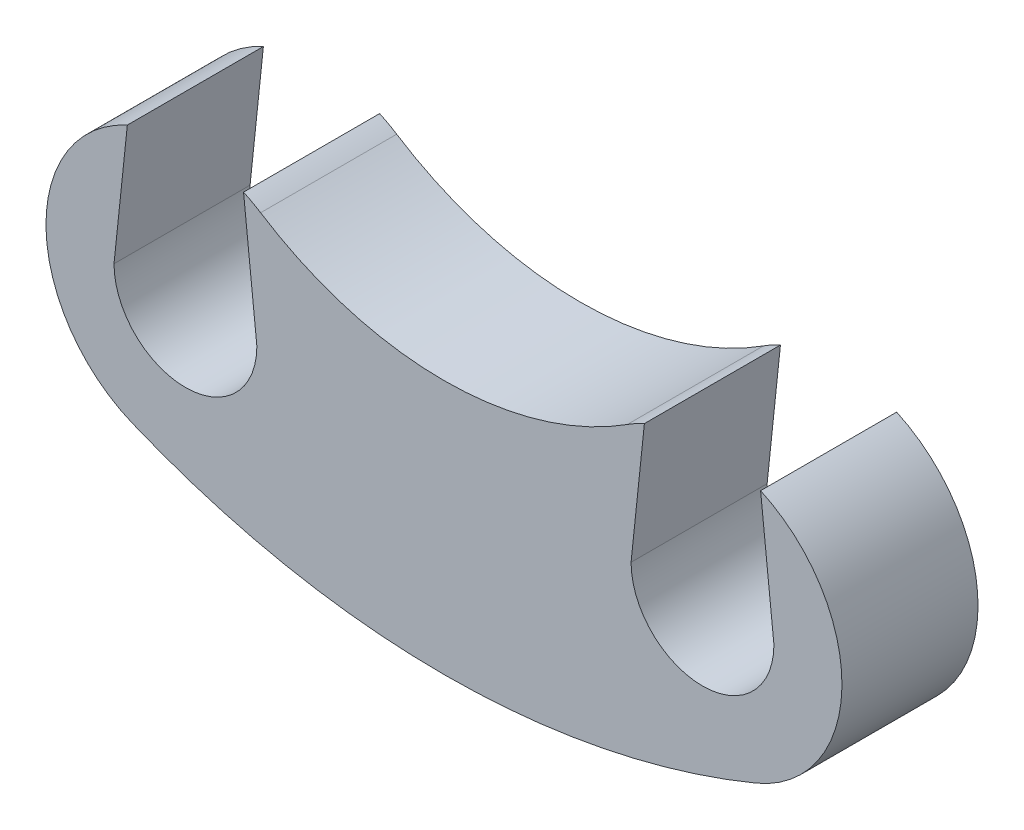
ISO-10303-21;
HEADER;
FILE_DESCRIPTION(('STEP AP214'),'2;1');
FILE_NAME('part.step','',(''),(''),'','','');
FILE_SCHEMA(('AUTOMOTIVE_DESIGN { 1 0 10303 214 1 1 1 1 }'));
ENDSEC;
DATA;
#1=APPLICATION_CONTEXT('core data for automotive mechanical design processes');
#2=APPLICATION_PROTOCOL_DEFINITION('international standard','automotive_design',2000,#1);
#3=PRODUCT_CONTEXT('',#1,'mechanical');
#4=PRODUCT('Part','Part','',(#3));
#5=PRODUCT_RELATED_PRODUCT_CATEGORY('part','',(#4));
#6=PRODUCT_DEFINITION_FORMATION('','',#4);
#7=PRODUCT_DEFINITION_CONTEXT('part definition',#1,'design');
#8=PRODUCT_DEFINITION('design','',#6,#7);
#9=PRODUCT_DEFINITION_SHAPE('','',#8);
#10=(LENGTH_UNIT() NAMED_UNIT(*) SI_UNIT(.MILLI.,.METRE.));
#11=(NAMED_UNIT(*) PLANE_ANGLE_UNIT() SI_UNIT($,.RADIAN.));
#12=(NAMED_UNIT(*) SI_UNIT($,.STERADIAN.) SOLID_ANGLE_UNIT());
#13=UNCERTAINTY_MEASURE_WITH_UNIT(LENGTH_MEASURE(1.E-05),#10,'distance_accuracy_value','');
#14=(GEOMETRIC_REPRESENTATION_CONTEXT(3) GLOBAL_UNCERTAINTY_ASSIGNED_CONTEXT((#13)) GLOBAL_UNIT_ASSIGNED_CONTEXT((#10,
#11,#12)) REPRESENTATION_CONTEXT('',''));
#15=CARTESIAN_POINT('',(0.,0.,0.));
#16=DIRECTION('',(0.,0.,1.));
#17=DIRECTION('',(1.,0.,0.));
#18=AXIS2_PLACEMENT_3D('',#15,#16,#17);
#19=CARTESIAN_POINT('',(0.,0.,10.));
#20=DIRECTION('',(0.,0.,-1.));
#21=DIRECTION('',(-1.,0.,0.));
#22=AXIS2_PLACEMENT_3D('',#19,#20,#21);
#23=CYLINDRICAL_SURFACE('',#22,10.25);
#24=CARTESIAN_POINT('',(0.,0.,0.));
#25=DIRECTION('',(0.,0.,1.));
#26=DIRECTION('',(-1.,0.,0.));
#27=AXIS2_PLACEMENT_3D('',#24,#25,#26);
#28=CIRCLE('',#27,10.25);
#29=CARTESIAN_POINT('',(-4.27064453791528,9.31794479650821,0.));
#30=VERTEX_POINT('',#29);
#31=CARTESIAN_POINT('',(-3.91457286432163,-9.47304699080063,0.));
#32=VERTEX_POINT('',#31);
#33=EDGE_CURVE('E153',#30,#32,#28,.T.);
#34=ORIENTED_EDGE('',*,*,#33,.T.);
#35=DIRECTION('',(0.,0.,-1.));
#36=VECTOR('',#35,1.);
#37=CARTESIAN_POINT('',(-3.91457286432163,-9.47304699080063,10.));
#38=LINE('',#37,#36);
#39=CARTESIAN_POINT('',(-3.91457286432163,-9.47304699080063,10.));
#40=VERTEX_POINT('',#39);
#41=EDGE_CURVE('E11',#40,#32,#38,.T.);
#42=ORIENTED_EDGE('',*,*,#41,.F.);
#43=CARTESIAN_POINT('',(0.,0.,10.));
#44=DIRECTION('',(0.,0.,1.));
#45=DIRECTION('',(-1.,0.,0.));
#46=AXIS2_PLACEMENT_3D('',#43,#44,#45);
#47=CIRCLE('',#46,10.25);
#48=CARTESIAN_POINT('',(-4.27064453791528,9.31794479650821,10.));
#49=VERTEX_POINT('',#48);
#50=EDGE_CURVE('E175',#49,#40,#47,.T.);
#51=ORIENTED_EDGE('',*,*,#50,.F.);
#52=DIRECTION('',(0.,0.,-1.));
#53=VECTOR('',#52,1.);
#54=CARTESIAN_POINT('',(-4.27064453791528,9.31794479650821,10.));
#55=LINE('',#54,#53);
#56=EDGE_CURVE('E149',#49,#30,#55,.T.);
#57=ORIENTED_EDGE('',*,*,#56,.T.);
#58=EDGE_LOOP('',(#34,#42,#51,#57));
#59=FACE_BOUND('',#58,.T.);
#60=ADVANCED_FACE('F33',(#59),#23,.T.);
#61=CARTESIAN_POINT('',(19.,45.9789353943738,10.));
#62=DIRECTION('',(0.,0.,-1.));
#63=DIRECTION('',(-1.,0.,0.));
#64=AXIS2_PLACEMENT_3D('',#61,#62,#63);
#65=CYLINDRICAL_SURFACE('',#64,60.);
#66=CARTESIAN_POINT('',(19.,45.9789353943738,0.));
#67=DIRECTION('',(0.,0.,1.));
#68=DIRECTION('',(1.,0.,0.));
#69=AXIS2_PLACEMENT_3D('',#66,#67,#68);
#70=CIRCLE('',#69,60.);
#71=CARTESIAN_POINT('',(41.9145728643216,-9.47304699080064,0.));
#72=VERTEX_POINT('',#71);
#73=EDGE_CURVE('E156',#32,#72,#70,.T.);
#74=ORIENTED_EDGE('',*,*,#73,.T.);
#75=DIRECTION('',(0.,0.,-1.));
#76=VECTOR('',#75,1.);
#77=CARTESIAN_POINT('',(41.9145728643216,-9.47304699080064,10.));
#78=LINE('',#77,#76);
#79=CARTESIAN_POINT('',(41.9145728643216,-9.47304699080064,10.));
#80=VERTEX_POINT('',#79);
#81=EDGE_CURVE('E41',#80,#72,#78,.T.);
#82=ORIENTED_EDGE('',*,*,#81,.F.);
#83=CARTESIAN_POINT('',(19.,45.9789353943738,10.));
#84=DIRECTION('',(0.,0.,1.));
#85=DIRECTION('',(1.,0.,0.));
#86=AXIS2_PLACEMENT_3D('',#83,#84,#85);
#87=CIRCLE('',#86,60.);
#88=EDGE_CURVE('E104',#40,#80,#87,.T.);
#89=ORIENTED_EDGE('',*,*,#88,.F.);
#90=ORIENTED_EDGE('',*,*,#41,.T.);
#91=EDGE_LOOP('',(#74,#82,#89,#90));
#92=FACE_BOUND('',#91,.T.);
#93=ADVANCED_FACE('F253',(#92),#65,.T.);
#94=CARTESIAN_POINT('',(38.,0.,10.));
#95=DIRECTION('',(0.,0.,-1.));
#96=DIRECTION('',(-1.,0.,0.));
#97=AXIS2_PLACEMENT_3D('',#94,#95,#96);
#98=CYLINDRICAL_SURFACE('',#97,10.25);
#99=CARTESIAN_POINT('',(38.,0.,0.));
#100=DIRECTION('',(0.,0.,1.));
#101=DIRECTION('',(-1.,0.,0.));
#102=AXIS2_PLACEMENT_3D('',#99,#100,#101);
#103=CIRCLE('',#102,10.25);
#104=CARTESIAN_POINT('',(42.2706445379153,9.31794479650821,0.));
#105=VERTEX_POINT('',#104);
#106=EDGE_CURVE('E158',#72,#105,#103,.T.);
#107=ORIENTED_EDGE('',*,*,#106,.T.);
#108=DIRECTION('',(0.,0.,-1.));
#109=VECTOR('',#108,1.);
#110=CARTESIAN_POINT('',(42.2706445379153,9.31794479650821,10.));
#111=LINE('',#110,#109);
#112=CARTESIAN_POINT('',(42.2706445379153,9.31794479650821,10.));
#113=VERTEX_POINT('',#112);
#114=EDGE_CURVE('E194',#113,#105,#111,.T.);
#115=ORIENTED_EDGE('',*,*,#114,.F.);
#116=CARTESIAN_POINT('',(38.,0.,10.));
#117=DIRECTION('',(0.,0.,1.));
#118=DIRECTION('',(-1.,0.,0.));
#119=AXIS2_PLACEMENT_3D('',#116,#117,#118);
#120=CIRCLE('',#119,10.25);
#121=EDGE_CURVE('E202',#80,#113,#120,.T.);
#122=ORIENTED_EDGE('',*,*,#121,.F.);
#123=ORIENTED_EDGE('',*,*,#81,.T.);
#124=EDGE_LOOP('',(#107,#115,#122,#123));
#125=FACE_BOUND('',#124,.T.);
#126=ADVANCED_FACE('F200',(#125),#98,.T.);
#127=CARTESIAN_POINT('',(42.2706445379153,9.31794479650821,10.));
#128=DIRECTION('',(0.994521895368274,0.104528463267647,0.));
#129=DIRECTION('',(-0.104528463267647,0.994521895368274,0.));
#130=AXIS2_PLACEMENT_3D('',#127,#128,#129);
#131=PLANE('',#130);
#132=DIRECTION('',(0.104528463267647,-0.994521895368274,0.));
#133=VECTOR('',#132,1.);
#134=CARTESIAN_POINT('',(42.2706445379153,9.31794479650821,0.));
#135=LINE('',#134,#133);
#136=CARTESIAN_POINT('',(43.25,0.,0.));
#137=VERTEX_POINT('',#136);
#138=EDGE_CURVE('E160',#105,#137,#135,.T.);
#139=ORIENTED_EDGE('',*,*,#138,.T.);
#140=DIRECTION('',(0.,0.,-1.));
#141=VECTOR('',#140,1.);
#142=CARTESIAN_POINT('',(43.25,0.,10.));
#143=LINE('',#142,#141);
#144=CARTESIAN_POINT('',(43.25,0.,10.));
#145=VERTEX_POINT('',#144);
#146=EDGE_CURVE('E191',#145,#137,#143,.T.);
#147=ORIENTED_EDGE('',*,*,#146,.F.);
#148=DIRECTION('',(0.104528463267647,-0.994521895368274,0.));
#149=VECTOR('',#148,1.);
#150=CARTESIAN_POINT('',(42.2706445379153,9.31794479650821,10.));
#151=LINE('',#150,#149);
#152=EDGE_CURVE('E220',#113,#145,#151,.T.);
#153=ORIENTED_EDGE('',*,*,#152,.F.);
#154=ORIENTED_EDGE('',*,*,#114,.T.);
#155=EDGE_LOOP('',(#139,#147,#153,#154));
#156=FACE_BOUND('',#155,.T.);
#157=ADVANCED_FACE('F211',(#156),#131,.F.);
#158=CARTESIAN_POINT('',(38.,0.,10.));
#159=DIRECTION('',(0.,0.,-1.));
#160=DIRECTION('',(-1.,0.,0.));
#161=AXIS2_PLACEMENT_3D('',#158,#159,#160);
#162=CYLINDRICAL_SURFACE('',#161,5.25);
#163=CARTESIAN_POINT('',(38.,0.,0.));
#164=DIRECTION('',(0.,0.,-1.));
#165=DIRECTION('',(1.,0.,0.));
#166=AXIS2_PLACEMENT_3D('',#163,#164,#165);
#167=CIRCLE('',#166,5.25);
#168=CARTESIAN_POINT('',(32.75,0.,0.));
#169=VERTEX_POINT('',#168);
#170=EDGE_CURVE('E162',#137,#169,#167,.T.);
#171=ORIENTED_EDGE('',*,*,#170,.T.);
#172=DIRECTION('',(0.,0.,-1.));
#173=VECTOR('',#172,1.);
#174=CARTESIAN_POINT('',(32.75,0.,10.));
#175=LINE('',#174,#173);
#176=CARTESIAN_POINT('',(32.75,0.,10.));
#177=VERTEX_POINT('',#176);
#178=EDGE_CURVE('E188',#177,#169,#175,.T.);
#179=ORIENTED_EDGE('',*,*,#178,.F.);
#180=CARTESIAN_POINT('',(38.,0.,10.));
#181=DIRECTION('',(0.,0.,-1.));
#182=DIRECTION('',(1.,0.,0.));
#183=AXIS2_PLACEMENT_3D('',#180,#181,#182);
#184=CIRCLE('',#183,5.25);
#185=EDGE_CURVE('E217',#145,#177,#184,.T.);
#186=ORIENTED_EDGE('',*,*,#185,.F.);
#187=ORIENTED_EDGE('',*,*,#146,.T.);
#188=EDGE_LOOP('',(#171,#179,#186,#187));
#189=FACE_BOUND('',#188,.T.);
#190=ADVANCED_FACE('F215',(#189),#162,.F.);
#191=CARTESIAN_POINT('',(33.7293554620847,9.31794479650821,10.));
#192=DIRECTION('',(-0.994521895368274,0.104528463267647,0.));
#193=DIRECTION('',(-0.104528463267647,-0.994521895368274,0.));
#194=AXIS2_PLACEMENT_3D('',#191,#192,#193);
#195=PLANE('',#194);
#196=DIRECTION('',(0.104528463267647,0.994521895368274,0.));
#197=VECTOR('',#196,1.);
#198=CARTESIAN_POINT('',(33.7293554620847,9.31794479650821,0.));
#199=LINE('',#198,#197);
#200=CARTESIAN_POINT('',(33.7293554620847,9.31794479650821,0.));
#201=VERTEX_POINT('',#200);
#202=EDGE_CURVE('E164',#169,#201,#199,.T.);
#203=ORIENTED_EDGE('',*,*,#202,.T.);
#204=DIRECTION('',(0.,0.,-1.));
#205=VECTOR('',#204,1.);
#206=CARTESIAN_POINT('',(33.7293554620847,9.31794479650821,10.));
#207=LINE('',#206,#205);
#208=CARTESIAN_POINT('',(33.7293554620847,9.31794479650821,10.));
#209=VERTEX_POINT('',#208);
#210=EDGE_CURVE('E185',#209,#201,#207,.T.);
#211=ORIENTED_EDGE('',*,*,#210,.F.);
#212=DIRECTION('',(0.104528463267647,0.994521895368274,0.));
#213=VECTOR('',#212,1.);
#214=CARTESIAN_POINT('',(33.7293554620847,9.31794479650821,10.));
#215=LINE('',#214,#213);
#216=EDGE_CURVE('E219',#177,#209,#215,.T.);
#217=ORIENTED_EDGE('',*,*,#216,.F.);
#218=ORIENTED_EDGE('',*,*,#178,.T.);
#219=EDGE_LOOP('',(#203,#211,#217,#218));
#220=FACE_BOUND('',#219,.T.);
#221=ADVANCED_FACE('F266',(#220),#195,.F.);
#222=CARTESIAN_POINT('',(38.,0.,10.));
#223=DIRECTION('',(0.,0.,-1.));
#224=DIRECTION('',(-1.,0.,0.));
#225=AXIS2_PLACEMENT_3D('',#222,#223,#224);
#226=CYLINDRICAL_SURFACE('',#225,10.25);
#227=CARTESIAN_POINT('',(38.,0.,0.));
#228=DIRECTION('',(0.,0.,1.));
#229=DIRECTION('',(-1.,0.,0.));
#230=AXIS2_PLACEMENT_3D('',#227,#228,#229);
#231=CIRCLE('',#230,10.25);
#232=CARTESIAN_POINT('',(32.4751773049645,8.6335875618668,0.));
#233=VERTEX_POINT('',#232);
#234=EDGE_CURVE('E166',#201,#233,#231,.T.);
#235=ORIENTED_EDGE('',*,*,#234,.T.);
#236=DIRECTION('',(0.,0.,-1.));
#237=VECTOR('',#236,1.);
#238=CARTESIAN_POINT('',(32.4751773049645,8.6335875618668,10.));
#239=LINE('',#238,#237);
#240=CARTESIAN_POINT('',(32.4751773049645,8.6335875618668,10.));
#241=VERTEX_POINT('',#240);
#242=EDGE_CURVE('E182',#241,#233,#239,.T.);
#243=ORIENTED_EDGE('',*,*,#242,.F.);
#244=CARTESIAN_POINT('',(38.,0.,10.));
#245=DIRECTION('',(0.,0.,1.));
#246=DIRECTION('',(-1.,0.,0.));
#247=AXIS2_PLACEMENT_3D('',#244,#245,#246);
#248=CIRCLE('',#247,10.25);
#249=EDGE_CURVE('E222',#209,#241,#248,.T.);
#250=ORIENTED_EDGE('',*,*,#249,.F.);
#251=ORIENTED_EDGE('',*,*,#210,.T.);
#252=EDGE_LOOP('',(#235,#243,#250,#251));
#253=FACE_BOUND('',#252,.T.);
#254=ADVANCED_FACE('F269',(#253),#226,.T.);
#255=CARTESIAN_POINT('',(19.,29.6911182005663,10.));
#256=DIRECTION('',(0.,0.,-1.));
#257=DIRECTION('',(-1.,0.,0.));
#258=AXIS2_PLACEMENT_3D('',#255,#256,#257);
#259=CYLINDRICAL_SURFACE('',#258,25.);
#260=CARTESIAN_POINT('',(19.,29.6911182005663,0.));
#261=DIRECTION('',(0.,0.,-1.));
#262=DIRECTION('',(1.,0.,0.));
#263=AXIS2_PLACEMENT_3D('',#260,#261,#262);
#264=CIRCLE('',#263,25.);
#265=CARTESIAN_POINT('',(5.52482269503545,8.63358756186681,0.));
#266=VERTEX_POINT('',#265);
#267=EDGE_CURVE('E168',#233,#266,#264,.T.);
#268=ORIENTED_EDGE('',*,*,#267,.T.);
#269=DIRECTION('',(0.,0.,-1.));
#270=VECTOR('',#269,1.);
#271=CARTESIAN_POINT('',(5.52482269503545,8.63358756186681,10.));
#272=LINE('',#271,#270);
#273=CARTESIAN_POINT('',(5.52482269503545,8.63358756186681,10.));
#274=VERTEX_POINT('',#273);
#275=EDGE_CURVE('E179',#274,#266,#272,.T.);
#276=ORIENTED_EDGE('',*,*,#275,.F.);
#277=CARTESIAN_POINT('',(19.,29.6911182005663,10.));
#278=DIRECTION('',(0.,0.,-1.));
#279=DIRECTION('',(1.,0.,0.));
#280=AXIS2_PLACEMENT_3D('',#277,#278,#279);
#281=CIRCLE('',#280,25.);
#282=EDGE_CURVE('E228',#241,#274,#281,.T.);
#283=ORIENTED_EDGE('',*,*,#282,.F.);
#284=ORIENTED_EDGE('',*,*,#242,.T.);
#285=EDGE_LOOP('',(#268,#276,#283,#284));
#286=FACE_BOUND('',#285,.T.);
#287=ADVANCED_FACE('F234',(#286),#259,.F.);
#288=CARTESIAN_POINT('',(-2.87096735274162E-13,-6.15826833971767E-13,10.));
#289=DIRECTION('',(0.,0.,-1.));
#290=DIRECTION('',(-1.,0.,0.));
#291=AXIS2_PLACEMENT_3D('',#288,#289,#290);
#292=CYLINDRICAL_SURFACE('',#291,10.2500000000007);
#293=CARTESIAN_POINT('',(-2.87096735274162E-13,-6.15826833971767E-13,0.));
#294=DIRECTION('',(0.,0.,1.));
#295=DIRECTION('',(1.,0.,0.));
#296=AXIS2_PLACEMENT_3D('',#293,#294,#295);
#297=CIRCLE('',#296,10.2500000000007);
#298=CARTESIAN_POINT('',(4.27064453791528,9.31794479650821,0.));
#299=VERTEX_POINT('',#298);
#300=EDGE_CURVE('E170',#266,#299,#297,.T.);
#301=ORIENTED_EDGE('',*,*,#300,.T.);
#302=DIRECTION('',(0.,0.,-1.));
#303=VECTOR('',#302,1.);
#304=CARTESIAN_POINT('',(4.27064453791528,9.31794479650821,10.));
#305=LINE('',#304,#303);
#306=CARTESIAN_POINT('',(4.27064453791528,9.31794479650821,10.));
#307=VERTEX_POINT('',#306);
#308=EDGE_CURVE('E144',#307,#299,#305,.T.);
#309=ORIENTED_EDGE('',*,*,#308,.F.);
#310=CARTESIAN_POINT('',(-2.87096735274162E-13,-6.15826833971767E-13,10.));
#311=DIRECTION('',(0.,0.,1.));
#312=DIRECTION('',(1.,0.,0.));
#313=AXIS2_PLACEMENT_3D('',#310,#311,#312);
#314=CIRCLE('',#313,10.2500000000007);
#315=EDGE_CURVE('E135',#274,#307,#314,.T.);
#316=ORIENTED_EDGE('',*,*,#315,.F.);
#317=ORIENTED_EDGE('',*,*,#275,.T.);
#318=EDGE_LOOP('',(#301,#309,#316,#317));
#319=FACE_BOUND('',#318,.T.);
#320=ADVANCED_FACE('F238',(#319),#292,.T.);
#321=CARTESIAN_POINT('',(4.27064453791528,9.31794479650821,10.));
#322=DIRECTION('',(0.994521895368274,0.104528463267647,0.));
#323=DIRECTION('',(-0.104528463267647,0.994521895368274,0.));
#324=AXIS2_PLACEMENT_3D('',#321,#322,#323);
#325=PLANE('',#324);
#326=DIRECTION('',(0.104528463267647,-0.994521895368274,0.));
#327=VECTOR('',#326,1.);
#328=CARTESIAN_POINT('',(4.27064453791528,9.31794479650821,0.));
#329=LINE('',#328,#327);
#330=CARTESIAN_POINT('',(5.25,0.,0.));
#331=VERTEX_POINT('',#330);
#332=EDGE_CURVE('E143',#299,#331,#329,.T.);
#333=ORIENTED_EDGE('',*,*,#332,.T.);
#334=DIRECTION('',(0.,0.,-1.));
#335=VECTOR('',#334,1.);
#336=CARTESIAN_POINT('',(5.25,0.,10.));
#337=LINE('',#336,#335);
#338=CARTESIAN_POINT('',(5.25,0.,10.));
#339=VERTEX_POINT('',#338);
#340=EDGE_CURVE('E140',#339,#331,#337,.T.);
#341=ORIENTED_EDGE('',*,*,#340,.F.);
#342=DIRECTION('',(0.104528463267647,-0.994521895368274,0.));
#343=VECTOR('',#342,1.);
#344=CARTESIAN_POINT('',(4.27064453791528,9.31794479650821,10.));
#345=LINE('',#344,#343);
#346=EDGE_CURVE('E129',#307,#339,#345,.T.);
#347=ORIENTED_EDGE('',*,*,#346,.F.);
#348=ORIENTED_EDGE('',*,*,#308,.T.);
#349=EDGE_LOOP('',(#333,#341,#347,#348));
#350=FACE_BOUND('',#349,.T.);
#351=ADVANCED_FACE('F141',(#350),#325,.F.);
#352=CARTESIAN_POINT('',(0.,0.,10.));
#353=DIRECTION('',(0.,0.,-1.));
#354=DIRECTION('',(-1.,0.,0.));
#355=AXIS2_PLACEMENT_3D('',#352,#353,#354);
#356=CYLINDRICAL_SURFACE('',#355,5.25);
#357=CARTESIAN_POINT('',(0.,0.,0.));
#358=DIRECTION('',(0.,0.,-1.));
#359=DIRECTION('',(1.,0.,0.));
#360=AXIS2_PLACEMENT_3D('',#357,#358,#359);
#361=CIRCLE('',#360,5.25);
#362=CARTESIAN_POINT('',(-5.25,0.,0.));
#363=VERTEX_POINT('',#362);
#364=EDGE_CURVE('E90',#331,#363,#361,.T.);
#365=ORIENTED_EDGE('',*,*,#364,.T.);
#366=DIRECTION('',(0.,0.,-1.));
#367=VECTOR('',#366,1.);
#368=CARTESIAN_POINT('',(-5.25,0.,10.));
#369=LINE('',#368,#367);
#370=CARTESIAN_POINT('',(-5.25,0.,10.));
#371=VERTEX_POINT('',#370);
#372=EDGE_CURVE('E145',#371,#363,#369,.T.);
#373=ORIENTED_EDGE('',*,*,#372,.F.);
#374=CARTESIAN_POINT('',(0.,0.,10.));
#375=DIRECTION('',(0.,0.,-1.));
#376=DIRECTION('',(1.,0.,0.));
#377=AXIS2_PLACEMENT_3D('',#374,#375,#376);
#378=CIRCLE('',#377,5.25);
#379=EDGE_CURVE('E133',#339,#371,#378,.T.);
#380=ORIENTED_EDGE('',*,*,#379,.F.);
#381=ORIENTED_EDGE('',*,*,#340,.T.);
#382=EDGE_LOOP('',(#365,#373,#380,#381));
#383=FACE_BOUND('',#382,.T.);
#384=ADVANCED_FACE('F147',(#383),#356,.F.);
#385=CARTESIAN_POINT('',(-5.25,0.,10.));
#386=DIRECTION('',(-0.994521895368274,0.104528463267646,0.));
#387=DIRECTION('',(-0.104528463267646,-0.994521895368274,0.));
#388=AXIS2_PLACEMENT_3D('',#385,#386,#387);
#389=PLANE('',#388);
#390=DIRECTION('',(0.104528463267646,0.994521895368274,0.));
#391=VECTOR('',#390,1.);
#392=CARTESIAN_POINT('',(-5.25,0.,0.));
#393=LINE('',#392,#391);
#394=EDGE_CURVE('E96',#363,#30,#393,.T.);
#395=ORIENTED_EDGE('',*,*,#394,.T.);
#396=ORIENTED_EDGE('',*,*,#56,.F.);
#397=DIRECTION('',(0.104528463267646,0.994521895368274,0.));
#398=VECTOR('',#397,1.);
#399=CARTESIAN_POINT('',(-5.25,0.,10.));
#400=LINE('',#399,#398);
#401=EDGE_CURVE('E49',#371,#49,#400,.T.);
#402=ORIENTED_EDGE('',*,*,#401,.F.);
#403=ORIENTED_EDGE('',*,*,#372,.T.);
#404=EDGE_LOOP('',(#395,#396,#402,#403));
#405=FACE_BOUND('',#404,.T.);
#406=ADVANCED_FACE('F242',(#405),#389,.F.);
#407=CARTESIAN_POINT('',(0.,0.,10.));
#408=DIRECTION('',(0.,0.,-1.));
#409=DIRECTION('',(-1.,0.,0.));
#410=AXIS2_PLACEMENT_3D('',#407,#408,#409);
#411=PLANE('',#410);
#412=ORIENTED_EDGE('',*,*,#50,.T.);
#413=ORIENTED_EDGE('',*,*,#88,.T.);
#414=ORIENTED_EDGE('',*,*,#121,.T.);
#415=ORIENTED_EDGE('',*,*,#152,.T.);
#416=ORIENTED_EDGE('',*,*,#185,.T.);
#417=ORIENTED_EDGE('',*,*,#216,.T.);
#418=ORIENTED_EDGE('',*,*,#249,.T.);
#419=ORIENTED_EDGE('',*,*,#282,.T.);
#420=ORIENTED_EDGE('',*,*,#315,.T.);
#421=ORIENTED_EDGE('',*,*,#346,.T.);
#422=ORIENTED_EDGE('',*,*,#379,.T.);
#423=ORIENTED_EDGE('',*,*,#401,.T.);
#424=EDGE_LOOP('',(#412,#413,#414,#415,#416,#417,#418,#419,#420,#421,#422,#423));
#425=FACE_BOUND('',#424,.T.);
#426=ADVANCED_FACE('F131',(#425),#411,.F.);
#427=CARTESIAN_POINT('',(0.,0.,0.));
#428=DIRECTION('',(0.,0.,-1.));
#429=DIRECTION('',(-1.,0.,0.));
#430=AXIS2_PLACEMENT_3D('',#427,#428,#429);
#431=PLANE('',#430);
#432=ORIENTED_EDGE('',*,*,#33,.F.);
#433=ORIENTED_EDGE('',*,*,#394,.F.);
#434=ORIENTED_EDGE('',*,*,#364,.F.);
#435=ORIENTED_EDGE('',*,*,#332,.F.);
#436=ORIENTED_EDGE('',*,*,#300,.F.);
#437=ORIENTED_EDGE('',*,*,#267,.F.);
#438=ORIENTED_EDGE('',*,*,#234,.F.);
#439=ORIENTED_EDGE('',*,*,#202,.F.);
#440=ORIENTED_EDGE('',*,*,#170,.F.);
#441=ORIENTED_EDGE('',*,*,#138,.F.);
#442=ORIENTED_EDGE('',*,*,#106,.F.);
#443=ORIENTED_EDGE('',*,*,#73,.F.);
#444=EDGE_LOOP('',(#432,#433,#434,#435,#436,#437,#438,#439,#440,#441,#442,#443));
#445=FACE_BOUND('',#444,.T.);
#446=ADVANCED_FACE('F206',(#445),#431,.T.);
#447=CLOSED_SHELL('',(#60,#93,#126,#157,#190,#221,#254,#287,#320,#351,#384,#406,#426,#446));
#448=MANIFOLD_SOLID_BREP('B2',#447);
#449=ADVANCED_BREP_SHAPE_REPRESENTATION('',(#18,#448),#14);
#450=SHAPE_DEFINITION_REPRESENTATION(#9,#449);
ENDSEC;
END-ISO-10303-21;
